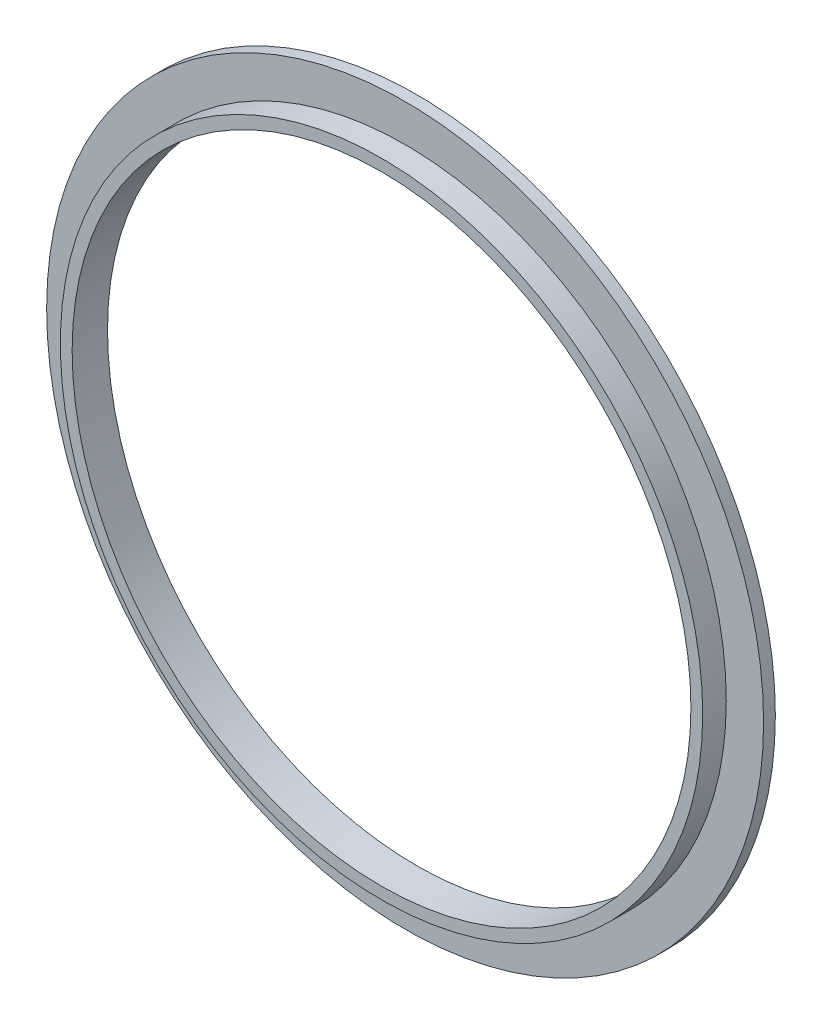
ISO-10303-21;
HEADER;
FILE_DESCRIPTION(('STEP AP214'),'2;1');
FILE_NAME('part.step','',(''),(''),'','','');
FILE_SCHEMA(('AUTOMOTIVE_DESIGN { 1 0 10303 214 1 1 1 1 }'));
ENDSEC;
DATA;
#1=APPLICATION_CONTEXT('core data for automotive mechanical design processes');
#2=APPLICATION_PROTOCOL_DEFINITION('international standard','automotive_design',2000,#1);
#3=PRODUCT_CONTEXT('',#1,'mechanical');
#4=PRODUCT('Part','Part','',(#3));
#5=PRODUCT_RELATED_PRODUCT_CATEGORY('part','',(#4));
#6=PRODUCT_DEFINITION_FORMATION('','',#4);
#7=PRODUCT_DEFINITION_CONTEXT('part definition',#1,'design');
#8=PRODUCT_DEFINITION('design','',#6,#7);
#9=PRODUCT_DEFINITION_SHAPE('','',#8);
#10=(LENGTH_UNIT() NAMED_UNIT(*) SI_UNIT(.MILLI.,.METRE.));
#11=(NAMED_UNIT(*) PLANE_ANGLE_UNIT() SI_UNIT($,.RADIAN.));
#12=(NAMED_UNIT(*) SI_UNIT($,.STERADIAN.) SOLID_ANGLE_UNIT());
#13=UNCERTAINTY_MEASURE_WITH_UNIT(LENGTH_MEASURE(1.E-05),#10,'distance_accuracy_value','');
#14=(GEOMETRIC_REPRESENTATION_CONTEXT(3) GLOBAL_UNCERTAINTY_ASSIGNED_CONTEXT((#13)) GLOBAL_UNIT_ASSIGNED_CONTEXT((#10,
#11,#12)) REPRESENTATION_CONTEXT('',''));
#15=CARTESIAN_POINT('',(0.,0.,0.));
#16=DIRECTION('',(0.,0.,1.));
#17=DIRECTION('',(1.,0.,0.));
#18=AXIS2_PLACEMENT_3D('',#15,#16,#17);
#19=CARTESIAN_POINT('',(0.,0.,4.));
#20=DIRECTION('',(0.,0.,1.));
#21=DIRECTION('',(1.,0.,0.));
#22=AXIS2_PLACEMENT_3D('',#19,#20,#21);
#23=PLANE('',#22);
#24=CARTESIAN_POINT('',(0.,0.,4.));
#25=DIRECTION('',(0.,0.,1.));
#26=DIRECTION('',(1.,0.,0.));
#27=AXIS2_PLACEMENT_3D('',#24,#25,#26);
#28=CIRCLE('',#27,54.5);
#29=CARTESIAN_POINT('',(54.5,0.,4.));
#30=VERTEX_POINT('',#29);
#31=EDGE_CURVE('E10',#30,#30,#28,.T.);
#32=ORIENTED_EDGE('',*,*,#31,.T.);
#33=EDGE_LOOP('',(#32));
#34=FACE_BOUND('',#33,.T.);
#35=CARTESIAN_POINT('',(0.,0.,4.));
#36=DIRECTION('',(0.,0.,1.));
#37=DIRECTION('',(1.,0.,0.));
#38=AXIS2_PLACEMENT_3D('',#35,#36,#37);
#39=CIRCLE('',#38,52.5);
#40=CARTESIAN_POINT('',(52.5,0.,4.));
#41=VERTEX_POINT('',#40);
#42=EDGE_CURVE('E49',#41,#41,#39,.T.);
#43=ORIENTED_EDGE('',*,*,#42,.F.);
#44=EDGE_LOOP('',(#43));
#45=FACE_BOUND('',#44,.T.);
#46=ADVANCED_FACE('F40',(#34,#45),#23,.T.);
#47=CARTESIAN_POINT('',(0.,0.,4.));
#48=DIRECTION('',(0.,0.,-1.));
#49=DIRECTION('',(-1.,0.,0.));
#50=AXIS2_PLACEMENT_3D('',#47,#48,#49);
#51=CYLINDRICAL_SURFACE('',#50,54.5);
#52=ORIENTED_EDGE('',*,*,#31,.F.);
#53=EDGE_LOOP('',(#52));
#54=FACE_BOUND('',#53,.T.);
#55=CARTESIAN_POINT('',(0.,0.,0.));
#56=DIRECTION('',(0.,0.,1.));
#57=DIRECTION('',(1.,0.,0.));
#58=AXIS2_PLACEMENT_3D('',#55,#56,#57);
#59=CIRCLE('',#58,54.5);
#60=CARTESIAN_POINT('',(54.5,0.,0.));
#61=VERTEX_POINT('',#60);
#62=EDGE_CURVE('E44',#61,#61,#59,.T.);
#63=ORIENTED_EDGE('',*,*,#62,.T.);
#64=EDGE_LOOP('',(#63));
#65=FACE_BOUND('',#64,.T.);
#66=ADVANCED_FACE('F42',(#54,#65),#51,.T.);
#67=CARTESIAN_POINT('',(0.,0.,4.));
#68=DIRECTION('',(0.,0.,-1.));
#69=DIRECTION('',(-1.,0.,0.));
#70=AXIS2_PLACEMENT_3D('',#67,#68,#69);
#71=CYLINDRICAL_SURFACE('',#70,52.5);
#72=ORIENTED_EDGE('',*,*,#42,.T.);
#73=EDGE_LOOP('',(#72));
#74=FACE_BOUND('',#73,.T.);
#75=CARTESIAN_POINT('',(0.,0.,-2.));
#76=DIRECTION('',(0.,0.,-1.));
#77=DIRECTION('',(-1.,0.,0.));
#78=AXIS2_PLACEMENT_3D('',#75,#76,#77);
#79=CIRCLE('',#78,52.5);
#80=CARTESIAN_POINT('',(-52.5,0.,-2.));
#81=VERTEX_POINT('',#80);
#82=EDGE_CURVE('E61',#81,#81,#79,.T.);
#83=ORIENTED_EDGE('',*,*,#82,.T.);
#84=EDGE_LOOP('',(#83));
#85=FACE_BOUND('',#84,.T.);
#86=ADVANCED_FACE('F69',(#74,#85),#71,.F.);
#87=CARTESIAN_POINT('',(0.,0.,-2.));
#88=DIRECTION('',(0.,0.,-1.));
#89=DIRECTION('',(-1.,0.,0.));
#90=AXIS2_PLACEMENT_3D('',#87,#88,#89);
#91=PLANE('',#90);
#92=CARTESIAN_POINT('',(0.,0.,-2.));
#93=DIRECTION('',(0.,0.,-1.));
#94=DIRECTION('',(-1.,0.,0.));
#95=AXIS2_PLACEMENT_3D('',#92,#93,#94);
#96=CIRCLE('',#95,60.83);
#97=CARTESIAN_POINT('',(-60.83,0.,-2.));
#98=VERTEX_POINT('',#97);
#99=EDGE_CURVE('E60',#98,#98,#96,.T.);
#100=ORIENTED_EDGE('',*,*,#99,.T.);
#101=EDGE_LOOP('',(#100));
#102=FACE_BOUND('',#101,.T.);
#103=ORIENTED_EDGE('',*,*,#82,.F.);
#104=EDGE_LOOP('',(#103));
#105=FACE_BOUND('',#104,.T.);
#106=ADVANCED_FACE('F71',(#102,#105),#91,.T.);
#107=CARTESIAN_POINT('',(0.,0.,0.));
#108=DIRECTION('',(0.,0.,-1.));
#109=DIRECTION('',(-1.,0.,0.));
#110=AXIS2_PLACEMENT_3D('',#107,#108,#109);
#111=PLANE('',#110);
#112=ORIENTED_EDGE('',*,*,#62,.F.);
#113=EDGE_LOOP('',(#112));
#114=FACE_BOUND('',#113,.T.);
#115=CARTESIAN_POINT('',(0.,0.,0.));
#116=DIRECTION('',(0.,0.,-1.));
#117=DIRECTION('',(-1.,0.,0.));
#118=AXIS2_PLACEMENT_3D('',#115,#116,#117);
#119=CIRCLE('',#118,60.83);
#120=CARTESIAN_POINT('',(-60.83,0.,0.));
#121=VERTEX_POINT('',#120);
#122=EDGE_CURVE('E56',#121,#121,#119,.T.);
#123=ORIENTED_EDGE('',*,*,#122,.F.);
#124=EDGE_LOOP('',(#123));
#125=FACE_BOUND('',#124,.T.);
#126=ADVANCED_FACE('F73',(#114,#125),#111,.F.);
#127=CARTESIAN_POINT('',(0.,0.,-2.));
#128=DIRECTION('',(0.,0.,1.));
#129=DIRECTION('',(1.,0.,0.));
#130=AXIS2_PLACEMENT_3D('',#127,#128,#129);
#131=CYLINDRICAL_SURFACE('',#130,60.83);
#132=ORIENTED_EDGE('',*,*,#99,.F.);
#133=EDGE_LOOP('',(#132));
#134=FACE_BOUND('',#133,.T.);
#135=ORIENTED_EDGE('',*,*,#122,.T.);
#136=EDGE_LOOP('',(#135));
#137=FACE_BOUND('',#136,.T.);
#138=ADVANCED_FACE('F80',(#134,#137),#131,.T.);
#139=CLOSED_SHELL('',(#46,#66,#86,#106,#126,#138));
#140=MANIFOLD_SOLID_BREP('B2',#139);
#141=ADVANCED_BREP_SHAPE_REPRESENTATION('',(#18,#140),#14);
#142=SHAPE_DEFINITION_REPRESENTATION(#9,#141);
ENDSEC;
END-ISO-10303-21;
